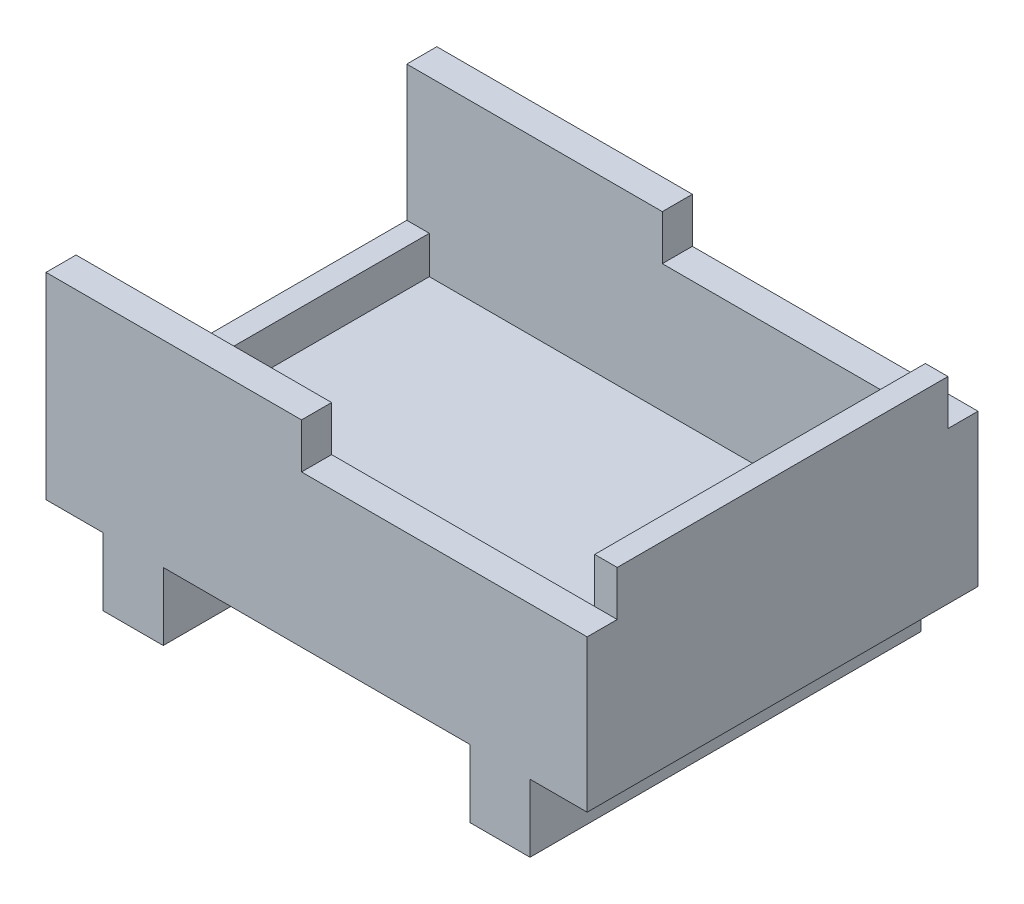
ISO-10303-21;
HEADER;
FILE_DESCRIPTION(('STEP AP214'),'2;1');
FILE_NAME('part.step','',(''),(''),'','','');
FILE_SCHEMA(('AUTOMOTIVE_DESIGN { 1 0 10303 214 1 1 1 1 }'));
ENDSEC;
DATA;
#1=APPLICATION_CONTEXT('core data for automotive mechanical design processes');
#2=APPLICATION_PROTOCOL_DEFINITION('international standard','automotive_design',2000,#1);
#3=PRODUCT_CONTEXT('',#1,'mechanical');
#4=PRODUCT('Part','Part','',(#3));
#5=PRODUCT_RELATED_PRODUCT_CATEGORY('part','',(#4));
#6=PRODUCT_DEFINITION_FORMATION('','',#4);
#7=PRODUCT_DEFINITION_CONTEXT('part definition',#1,'design');
#8=PRODUCT_DEFINITION('design','',#6,#7);
#9=PRODUCT_DEFINITION_SHAPE('','',#8);
#10=(LENGTH_UNIT() NAMED_UNIT(*) SI_UNIT(.MILLI.,.METRE.));
#11=(NAMED_UNIT(*) PLANE_ANGLE_UNIT() SI_UNIT($,.RADIAN.));
#12=(NAMED_UNIT(*) SI_UNIT($,.STERADIAN.) SOLID_ANGLE_UNIT());
#13=UNCERTAINTY_MEASURE_WITH_UNIT(LENGTH_MEASURE(1.E-05),#10,'distance_accuracy_value','');
#14=(GEOMETRIC_REPRESENTATION_CONTEXT(3) GLOBAL_UNCERTAINTY_ASSIGNED_CONTEXT((#13)) GLOBAL_UNIT_ASSIGNED_CONTEXT((#10,
#11,#12)) REPRESENTATION_CONTEXT('',''));
#15=CARTESIAN_POINT('',(0.,0.,0.));
#16=DIRECTION('',(0.,0.,1.));
#17=DIRECTION('',(1.,0.,0.));
#18=AXIS2_PLACEMENT_3D('',#15,#16,#17);
#19=CARTESIAN_POINT('',(0.,0.,0.));
#20=DIRECTION('',(0.,1.,0.));
#21=DIRECTION('',(0.,0.,1.));
#22=AXIS2_PLACEMENT_3D('',#19,#20,#21);
#23=PLANE('',#22);
#24=DIRECTION('',(0.,0.,1.));
#25=VECTOR('',#24,1.);
#26=CARTESIAN_POINT('',(-10.2,0.,-13.));
#27=LINE('',#26,#25);
#28=CARTESIAN_POINT('',(-10.2,0.,-13.));
#29=VERTEX_POINT('',#28);
#30=CARTESIAN_POINT('',(-10.2,0.,-10.));
#31=VERTEX_POINT('',#30);
#32=EDGE_CURVE('E298',#29,#31,#27,.T.);
#33=ORIENTED_EDGE('',*,*,#32,.F.);
#34=DIRECTION('',(-1.,0.,0.));
#35=VECTOR('',#34,1.);
#36=CARTESIAN_POINT('',(-18.,0.,-13.));
#37=LINE('',#36,#35);
#38=CARTESIAN_POINT('',(10.2,0.,-13.));
#39=VERTEX_POINT('',#38);
#40=EDGE_CURVE('E494',#39,#29,#37,.T.);
#41=ORIENTED_EDGE('',*,*,#40,.F.);
#42=DIRECTION('',(0.,0.,-1.));
#43=VECTOR('',#42,1.);
#44=CARTESIAN_POINT('',(10.2,0.,-13.));
#45=LINE('',#44,#43);
#46=CARTESIAN_POINT('',(10.2,0.,-9.99999999999999));
#47=VERTEX_POINT('',#46);
#48=EDGE_CURVE('E319',#47,#39,#45,.T.);
#49=ORIENTED_EDGE('',*,*,#48,.F.);
#50=DIRECTION('',(-1.,0.,0.));
#51=VECTOR('',#50,1.);
#52=CARTESIAN_POINT('',(10.2,0.,-9.99999999999999));
#53=LINE('',#52,#51);
#54=CARTESIAN_POINT('',(14.2,0.,-9.99999999999999));
#55=VERTEX_POINT('',#54);
#56=EDGE_CURVE('E321',#55,#47,#53,.T.);
#57=ORIENTED_EDGE('',*,*,#56,.F.);
#58=DIRECTION('',(0.,0.,1.));
#59=VECTOR('',#58,1.);
#60=CARTESIAN_POINT('',(14.2,0.,-13.));
#61=LINE('',#60,#59);
#62=CARTESIAN_POINT('',(14.2,0.,-13.));
#63=VERTEX_POINT('',#62);
#64=EDGE_CURVE('E315',#63,#55,#61,.T.);
#65=ORIENTED_EDGE('',*,*,#64,.F.);
#66=CARTESIAN_POINT('',(18.,0.,-13.));
#67=VERTEX_POINT('',#66);
#68=EDGE_CURVE('E490',#67,#63,#37,.T.);
#69=ORIENTED_EDGE('',*,*,#68,.F.);
#70=DIRECTION('',(0.,0.,-1.));
#71=VECTOR('',#70,1.);
#72=CARTESIAN_POINT('',(18.,0.,-13.));
#73=LINE('',#72,#71);
#74=CARTESIAN_POINT('',(18.,0.,13.));
#75=VERTEX_POINT('',#74);
#76=EDGE_CURVE('E478',#75,#67,#73,.T.);
#77=ORIENTED_EDGE('',*,*,#76,.F.);
#78=DIRECTION('',(1.,0.,0.));
#79=VECTOR('',#78,1.);
#80=CARTESIAN_POINT('',(-18.,0.,13.));
#81=LINE('',#80,#79);
#82=CARTESIAN_POINT('',(14.2,0.,13.));
#83=VERTEX_POINT('',#82);
#84=EDGE_CURVE('E497',#83,#75,#81,.T.);
#85=ORIENTED_EDGE('',*,*,#84,.F.);
#86=DIRECTION('',(0.,0.,1.));
#87=VECTOR('',#86,1.);
#88=CARTESIAN_POINT('',(14.2,0.,13.));
#89=LINE('',#88,#87);
#90=CARTESIAN_POINT('',(14.2,0.,9.99999999999999));
#91=VERTEX_POINT('',#90);
#92=EDGE_CURVE('E338',#91,#83,#89,.T.);
#93=ORIENTED_EDGE('',*,*,#92,.F.);
#94=DIRECTION('',(1.,0.,0.));
#95=VECTOR('',#94,1.);
#96=CARTESIAN_POINT('',(10.2,0.,9.99999999999999));
#97=LINE('',#96,#95);
#98=CARTESIAN_POINT('',(10.2,0.,9.99999999999999));
#99=VERTEX_POINT('',#98);
#100=EDGE_CURVE('E341',#99,#91,#97,.T.);
#101=ORIENTED_EDGE('',*,*,#100,.F.);
#102=DIRECTION('',(0.,0.,-1.));
#103=VECTOR('',#102,1.);
#104=CARTESIAN_POINT('',(10.2,0.,13.));
#105=LINE('',#104,#103);
#106=CARTESIAN_POINT('',(10.2,0.,13.));
#107=VERTEX_POINT('',#106);
#108=EDGE_CURVE('E333',#107,#99,#105,.T.);
#109=ORIENTED_EDGE('',*,*,#108,.F.);
#110=CARTESIAN_POINT('',(-10.2,0.,13.));
#111=VERTEX_POINT('',#110);
#112=EDGE_CURVE('E502',#111,#107,#81,.T.);
#113=ORIENTED_EDGE('',*,*,#112,.F.);
#114=DIRECTION('',(0.,0.,1.));
#115=VECTOR('',#114,1.);
#116=CARTESIAN_POINT('',(-10.2,0.,13.));
#117=LINE('',#116,#115);
#118=CARTESIAN_POINT('',(-10.2,0.,9.99999999999999));
#119=VERTEX_POINT('',#118);
#120=EDGE_CURVE('E358',#119,#111,#117,.T.);
#121=ORIENTED_EDGE('',*,*,#120,.F.);
#122=DIRECTION('',(1.,0.,0.));
#123=VECTOR('',#122,1.);
#124=CARTESIAN_POINT('',(-10.2,0.,9.99999999999999));
#125=LINE('',#124,#123);
#126=CARTESIAN_POINT('',(-14.2,0.,9.99999999999999));
#127=VERTEX_POINT('',#126);
#128=EDGE_CURVE('E360',#127,#119,#125,.T.);
#129=ORIENTED_EDGE('',*,*,#128,.F.);
#130=DIRECTION('',(0.,0.,-1.));
#131=VECTOR('',#130,1.);
#132=CARTESIAN_POINT('',(-14.2,0.,13.));
#133=LINE('',#132,#131);
#134=CARTESIAN_POINT('',(-14.2,0.,13.));
#135=VERTEX_POINT('',#134);
#136=EDGE_CURVE('E353',#135,#127,#133,.T.);
#137=ORIENTED_EDGE('',*,*,#136,.F.);
#138=CARTESIAN_POINT('',(-18.,0.,13.));
#139=VERTEX_POINT('',#138);
#140=EDGE_CURVE('E498',#139,#135,#81,.T.);
#141=ORIENTED_EDGE('',*,*,#140,.F.);
#142=DIRECTION('',(0.,0.,1.));
#143=VECTOR('',#142,1.);
#144=CARTESIAN_POINT('',(-18.,0.,-13.));
#145=LINE('',#144,#143);
#146=CARTESIAN_POINT('',(-18.,0.,-13.));
#147=VERTEX_POINT('',#146);
#148=EDGE_CURVE('E493',#147,#139,#145,.T.);
#149=ORIENTED_EDGE('',*,*,#148,.F.);
#150=CARTESIAN_POINT('',(-14.2,0.,-13.));
#151=VERTEX_POINT('',#150);
#152=EDGE_CURVE('E489',#151,#147,#37,.T.);
#153=ORIENTED_EDGE('',*,*,#152,.F.);
#154=DIRECTION('',(0.,0.,-1.));
#155=VECTOR('',#154,1.);
#156=CARTESIAN_POINT('',(-14.2,0.,-13.));
#157=LINE('',#156,#155);
#158=CARTESIAN_POINT('',(-14.2,0.,-10.));
#159=VERTEX_POINT('',#158);
#160=EDGE_CURVE('E256',#159,#151,#157,.T.);
#161=ORIENTED_EDGE('',*,*,#160,.F.);
#162=DIRECTION('',(-1.,0.,0.));
#163=VECTOR('',#162,1.);
#164=CARTESIAN_POINT('',(-10.2,0.,-10.));
#165=LINE('',#164,#163);
#166=EDGE_CURVE('E308',#31,#159,#165,.T.);
#167=ORIENTED_EDGE('',*,*,#166,.F.);
#168=EDGE_LOOP('',(#33,#41,#49,#57,#65,#69,#77,#85,#93,#101,#109,#113,#121,#129,#137,#141,#149,
#153,#161,#167));
#169=FACE_BOUND('',#168,.T.);
#170=ADVANCED_FACE('F36',(#169),#23,.F.);
#171=CARTESIAN_POINT('',(0.,10.1,0.));
#172=DIRECTION('',(0.,1.,0.));
#173=DIRECTION('',(0.,0.,1.));
#174=AXIS2_PLACEMENT_3D('',#171,#172,#173);
#175=PLANE('',#174);
#176=DIRECTION('',(0.,0.,-1.));
#177=VECTOR('',#176,1.);
#178=CARTESIAN_POINT('',(18.,10.1,-13.));
#179=LINE('',#178,#177);
#180=CARTESIAN_POINT('',(18.,10.1,13.));
#181=VERTEX_POINT('',#180);
#182=CARTESIAN_POINT('',(18.,10.1,11.));
#183=VERTEX_POINT('',#182);
#184=EDGE_CURVE('E457',#181,#183,#179,.T.);
#185=ORIENTED_EDGE('',*,*,#184,.T.);
#186=DIRECTION('',(1.,0.,0.));
#187=VECTOR('',#186,1.);
#188=CARTESIAN_POINT('',(16.5,10.1,11.));
#189=LINE('',#188,#187);
#190=CARTESIAN_POINT('',(16.5,10.1,11.));
#191=VERTEX_POINT('',#190);
#192=EDGE_CURVE('E375',#191,#183,#189,.T.);
#193=ORIENTED_EDGE('',*,*,#192,.F.);
#194=DIRECTION('',(-1.,0.,0.));
#195=VECTOR('',#194,1.);
#196=CARTESIAN_POINT('',(-16.5,10.1,11.));
#197=LINE('',#196,#195);
#198=CARTESIAN_POINT('',(-0.999999999999997,10.1,11.));
#199=VERTEX_POINT('',#198);
#200=EDGE_CURVE('E461',#191,#199,#197,.T.);
#201=ORIENTED_EDGE('',*,*,#200,.T.);
#202=DIRECTION('',(0.,0.,-1.));
#203=VECTOR('',#202,1.);
#204=CARTESIAN_POINT('',(-0.999999999999997,10.1,11.));
#205=LINE('',#204,#203);
#206=CARTESIAN_POINT('',(-0.999999999999997,10.1,13.));
#207=VERTEX_POINT('',#206);
#208=EDGE_CURVE('E402',#207,#199,#205,.T.);
#209=ORIENTED_EDGE('',*,*,#208,.F.);
#210=DIRECTION('',(1.,0.,0.));
#211=VECTOR('',#210,1.);
#212=CARTESIAN_POINT('',(-18.,10.1,13.));
#213=LINE('',#212,#211);
#214=EDGE_CURVE('E453',#207,#181,#213,.T.);
#215=ORIENTED_EDGE('',*,*,#214,.T.);
#216=EDGE_LOOP('',(#185,#193,#201,#209,#215));
#217=FACE_BOUND('',#216,.T.);
#218=ADVANCED_FACE('F567',(#217),#175,.T.);
#219=DIRECTION('',(1.,0.,0.));
#220=VECTOR('',#219,1.);
#221=CARTESIAN_POINT('',(-16.5,10.1,-11.));
#222=LINE('',#221,#220);
#223=CARTESIAN_POINT('',(-0.999999999999997,10.1,-11.));
#224=VERTEX_POINT('',#223);
#225=CARTESIAN_POINT('',(16.5,10.1,-11.));
#226=VERTEX_POINT('',#225);
#227=EDGE_CURVE('E11',#224,#226,#222,.T.);
#228=ORIENTED_EDGE('',*,*,#227,.T.);
#229=DIRECTION('',(-1.,0.,0.));
#230=VECTOR('',#229,1.);
#231=CARTESIAN_POINT('',(16.5,10.1,-11.));
#232=LINE('',#231,#230);
#233=CARTESIAN_POINT('',(18.,10.1,-11.));
#234=VERTEX_POINT('',#233);
#235=EDGE_CURVE('E380',#234,#226,#232,.T.);
#236=ORIENTED_EDGE('',*,*,#235,.F.);
#237=CARTESIAN_POINT('',(18.,10.1,-13.));
#238=VERTEX_POINT('',#237);
#239=EDGE_CURVE('E456',#234,#238,#179,.T.);
#240=ORIENTED_EDGE('',*,*,#239,.T.);
#241=DIRECTION('',(-1.,0.,0.));
#242=VECTOR('',#241,1.);
#243=CARTESIAN_POINT('',(-18.,10.1,-13.));
#244=LINE('',#243,#242);
#245=CARTESIAN_POINT('',(-0.999999999999997,10.1,-13.));
#246=VERTEX_POINT('',#245);
#247=EDGE_CURVE('E459',#238,#246,#244,.T.);
#248=ORIENTED_EDGE('',*,*,#247,.T.);
#249=DIRECTION('',(0.,0.,-1.));
#250=VECTOR('',#249,1.);
#251=CARTESIAN_POINT('',(-0.999999999999997,10.1,-13.));
#252=LINE('',#251,#250);
#253=EDGE_CURVE('E421',#224,#246,#252,.T.);
#254=ORIENTED_EDGE('',*,*,#253,.F.);
#255=EDGE_LOOP('',(#228,#236,#240,#248,#254));
#256=FACE_BOUND('',#255,.T.);
#257=ADVANCED_FACE('F572',(#256),#175,.T.);
#258=CARTESIAN_POINT('',(18.,14.6,-13.));
#259=DIRECTION('',(-1.,0.,0.));
#260=DIRECTION('',(0.,0.,1.));
#261=AXIS2_PLACEMENT_3D('',#258,#259,#260);
#262=PLANE('',#261);
#263=ORIENTED_EDGE('',*,*,#184,.F.);
#264=DIRECTION('',(0.,-1.,0.));
#265=VECTOR('',#264,1.);
#266=CARTESIAN_POINT('',(18.,14.6,13.));
#267=LINE('',#266,#265);
#268=EDGE_CURVE('E501',#181,#75,#267,.T.);
#269=ORIENTED_EDGE('',*,*,#268,.T.);
#270=ORIENTED_EDGE('',*,*,#76,.T.);
#271=DIRECTION('',(0.,-1.,0.));
#272=VECTOR('',#271,1.);
#273=CARTESIAN_POINT('',(18.,14.6,-13.));
#274=LINE('',#273,#272);
#275=EDGE_CURVE('E44',#238,#67,#274,.T.);
#276=ORIENTED_EDGE('',*,*,#275,.F.);
#277=ORIENTED_EDGE('',*,*,#239,.F.);
#278=DIRECTION('',(0.,-1.,0.));
#279=VECTOR('',#278,1.);
#280=CARTESIAN_POINT('',(18.,13.1,-11.));
#281=LINE('',#280,#279);
#282=CARTESIAN_POINT('',(18.,13.1,-11.));
#283=VERTEX_POINT('',#282);
#284=EDGE_CURVE('E393',#283,#234,#281,.T.);
#285=ORIENTED_EDGE('',*,*,#284,.F.);
#286=DIRECTION('',(0.,0.,-1.));
#287=VECTOR('',#286,1.);
#288=CARTESIAN_POINT('',(18.,13.1,11.));
#289=LINE('',#288,#287);
#290=CARTESIAN_POINT('',(18.,13.1,11.));
#291=VERTEX_POINT('',#290);
#292=EDGE_CURVE('E382',#291,#283,#289,.T.);
#293=ORIENTED_EDGE('',*,*,#292,.F.);
#294=DIRECTION('',(0.,-1.,0.));
#295=VECTOR('',#294,1.);
#296=CARTESIAN_POINT('',(18.,13.1,11.));
#297=LINE('',#296,#295);
#298=EDGE_CURVE('E396',#291,#183,#297,.T.);
#299=ORIENTED_EDGE('',*,*,#298,.T.);
#300=EDGE_LOOP('',(#263,#269,#270,#276,#277,#285,#293,#299));
#301=FACE_BOUND('',#300,.T.);
#302=ADVANCED_FACE('F38',(#301),#262,.F.);
#303=CARTESIAN_POINT('',(-18.,14.6,-13.));
#304=DIRECTION('',(0.,0.,1.));
#305=DIRECTION('',(1.,0.,0.));
#306=AXIS2_PLACEMENT_3D('',#303,#304,#305);
#307=PLANE('',#306);
#308=ORIENTED_EDGE('',*,*,#247,.F.);
#309=ORIENTED_EDGE('',*,*,#275,.T.);
#310=ORIENTED_EDGE('',*,*,#68,.T.);
#311=DIRECTION('',(0.,1.,0.));
#312=VECTOR('',#311,1.);
#313=CARTESIAN_POINT('',(14.2,-2.,-13.));
#314=LINE('',#313,#312);
#315=CARTESIAN_POINT('',(14.2,-4.5,-13.));
#316=VERTEX_POINT('',#315);
#317=EDGE_CURVE('E331',#316,#63,#314,.T.);
#318=ORIENTED_EDGE('',*,*,#317,.F.);
#319=DIRECTION('',(1.,0.,0.));
#320=VECTOR('',#319,1.);
#321=CARTESIAN_POINT('',(14.2,-4.5,-13.));
#322=LINE('',#321,#320);
#323=CARTESIAN_POINT('',(10.2,-4.5,-13.));
#324=VERTEX_POINT('',#323);
#325=EDGE_CURVE('E295',#324,#316,#322,.T.);
#326=ORIENTED_EDGE('',*,*,#325,.F.);
#327=DIRECTION('',(0.,1.,0.));
#328=VECTOR('',#327,1.);
#329=CARTESIAN_POINT('',(10.2,-2.,-13.));
#330=LINE('',#329,#328);
#331=EDGE_CURVE('E58',#324,#39,#330,.T.);
#332=ORIENTED_EDGE('',*,*,#331,.T.);
#333=ORIENTED_EDGE('',*,*,#40,.T.);
#334=DIRECTION('',(0.,1.,0.));
#335=VECTOR('',#334,1.);
#336=CARTESIAN_POINT('',(-10.2,-2.,-13.));
#337=LINE('',#336,#335);
#338=CARTESIAN_POINT('',(-10.2,-4.5,-13.));
#339=VERTEX_POINT('',#338);
#340=EDGE_CURVE('E259',#339,#29,#337,.T.);
#341=ORIENTED_EDGE('',*,*,#340,.F.);
#342=DIRECTION('',(1.,0.,0.));
#343=VECTOR('',#342,1.);
#344=CARTESIAN_POINT('',(-14.2,-4.5,-13.));
#345=LINE('',#344,#343);
#346=CARTESIAN_POINT('',(-14.2,-4.5,-13.));
#347=VERTEX_POINT('',#346);
#348=EDGE_CURVE('E262',#347,#339,#345,.T.);
#349=ORIENTED_EDGE('',*,*,#348,.F.);
#350=DIRECTION('',(0.,1.,0.));
#351=VECTOR('',#350,1.);
#352=CARTESIAN_POINT('',(-14.2,-2.,-13.));
#353=LINE('',#352,#351);
#354=EDGE_CURVE('E51',#347,#151,#353,.T.);
#355=ORIENTED_EDGE('',*,*,#354,.T.);
#356=ORIENTED_EDGE('',*,*,#152,.T.);
#357=DIRECTION('',(0.,-1.,0.));
#358=VECTOR('',#357,1.);
#359=CARTESIAN_POINT('',(-18.,14.6,-13.));
#360=LINE('',#359,#358);
#361=CARTESIAN_POINT('',(-18.,13.1,-13.));
#362=VERTEX_POINT('',#361);
#363=EDGE_CURVE('E507',#362,#147,#360,.T.);
#364=ORIENTED_EDGE('',*,*,#363,.F.);
#365=DIRECTION('',(-1.,0.,0.));
#366=VECTOR('',#365,1.);
#367=CARTESIAN_POINT('',(-18.,13.1,-13.));
#368=LINE('',#367,#366);
#369=CARTESIAN_POINT('',(-0.999999999999997,13.1,-13.));
#370=VERTEX_POINT('',#369);
#371=EDGE_CURVE('E429',#370,#362,#368,.T.);
#372=ORIENTED_EDGE('',*,*,#371,.F.);
#373=DIRECTION('',(0.,-1.,0.));
#374=VECTOR('',#373,1.);
#375=CARTESIAN_POINT('',(-0.999999999999997,13.1,-13.));
#376=LINE('',#375,#374);
#377=EDGE_CURVE('E432',#370,#246,#376,.T.);
#378=ORIENTED_EDGE('',*,*,#377,.T.);
#379=EDGE_LOOP('',(#308,#309,#310,#318,#326,#332,#333,#341,#349,#355,#356,#364,#372,#378));
#380=FACE_BOUND('',#379,.T.);
#381=ADVANCED_FACE('F264',(#380),#307,.F.);
#382=CARTESIAN_POINT('',(-18.,14.6,-13.));
#383=DIRECTION('',(1.,0.,0.));
#384=DIRECTION('',(0.,0.,-1.));
#385=AXIS2_PLACEMENT_3D('',#382,#383,#384);
#386=PLANE('',#385);
#387=DIRECTION('',(0.,-1.,0.));
#388=VECTOR('',#387,1.);
#389=CARTESIAN_POINT('',(-18.,14.6,13.));
#390=LINE('',#389,#388);
#391=CARTESIAN_POINT('',(-18.,13.1,13.));
#392=VERTEX_POINT('',#391);
#393=EDGE_CURVE('E505',#392,#139,#390,.T.);
#394=ORIENTED_EDGE('',*,*,#393,.F.);
#395=DIRECTION('',(0.,0.,1.));
#396=VECTOR('',#395,1.);
#397=CARTESIAN_POINT('',(-18.,13.1,11.));
#398=LINE('',#397,#396);
#399=CARTESIAN_POINT('',(-18.,13.1,11.));
#400=VERTEX_POINT('',#399);
#401=EDGE_CURVE('E403',#400,#392,#398,.T.);
#402=ORIENTED_EDGE('',*,*,#401,.F.);
#403=DIRECTION('',(0.,1.,0.));
#404=VECTOR('',#403,1.);
#405=CARTESIAN_POINT('',(-18.,4.1,11.));
#406=LINE('',#405,#404);
#407=CARTESIAN_POINT('',(-18.,4.1,11.));
#408=VERTEX_POINT('',#407);
#409=EDGE_CURVE('E451',#408,#400,#406,.T.);
#410=ORIENTED_EDGE('',*,*,#409,.F.);
#411=DIRECTION('',(0.,0.,1.));
#412=VECTOR('',#411,1.);
#413=CARTESIAN_POINT('',(-18.,4.1,-11.));
#414=LINE('',#413,#412);
#415=CARTESIAN_POINT('',(-18.,4.1,-11.));
#416=VERTEX_POINT('',#415);
#417=EDGE_CURVE('E446',#416,#408,#414,.T.);
#418=ORIENTED_EDGE('',*,*,#417,.F.);
#419=DIRECTION('',(0.,1.,0.));
#420=VECTOR('',#419,1.);
#421=CARTESIAN_POINT('',(-18.,4.1,-11.));
#422=LINE('',#421,#420);
#423=CARTESIAN_POINT('',(-18.,13.1,-11.));
#424=VERTEX_POINT('',#423);
#425=EDGE_CURVE('E450',#416,#424,#422,.T.);
#426=ORIENTED_EDGE('',*,*,#425,.T.);
#427=DIRECTION('',(0.,0.,1.));
#428=VECTOR('',#427,1.);
#429=CARTESIAN_POINT('',(-18.,13.1,-13.));
#430=LINE('',#429,#428);
#431=EDGE_CURVE('E422',#362,#424,#430,.T.);
#432=ORIENTED_EDGE('',*,*,#431,.F.);
#433=ORIENTED_EDGE('',*,*,#363,.T.);
#434=ORIENTED_EDGE('',*,*,#148,.T.);
#435=EDGE_LOOP('',(#394,#402,#410,#418,#426,#432,#433,#434));
#436=FACE_BOUND('',#435,.T.);
#437=ADVANCED_FACE('F545',(#436),#386,.F.);
#438=CARTESIAN_POINT('',(-18.,14.6,13.));
#439=DIRECTION('',(0.,0.,-1.));
#440=DIRECTION('',(-1.,0.,0.));
#441=AXIS2_PLACEMENT_3D('',#438,#439,#440);
#442=PLANE('',#441);
#443=ORIENTED_EDGE('',*,*,#214,.F.);
#444=DIRECTION('',(0.,-1.,0.));
#445=VECTOR('',#444,1.);
#446=CARTESIAN_POINT('',(-0.999999999999997,13.1,13.));
#447=LINE('',#446,#445);
#448=CARTESIAN_POINT('',(-0.999999999999997,13.1,13.));
#449=VERTEX_POINT('',#448);
#450=EDGE_CURVE('E418',#449,#207,#447,.T.);
#451=ORIENTED_EDGE('',*,*,#450,.F.);
#452=DIRECTION('',(1.,0.,0.));
#453=VECTOR('',#452,1.);
#454=CARTESIAN_POINT('',(-18.,13.1,13.));
#455=LINE('',#454,#453);
#456=EDGE_CURVE('E406',#392,#449,#455,.T.);
#457=ORIENTED_EDGE('',*,*,#456,.F.);
#458=ORIENTED_EDGE('',*,*,#393,.T.);
#459=ORIENTED_EDGE('',*,*,#140,.T.);
#460=DIRECTION('',(0.,1.,0.));
#461=VECTOR('',#460,1.);
#462=CARTESIAN_POINT('',(-14.2,-2.,13.));
#463=LINE('',#462,#461);
#464=CARTESIAN_POINT('',(-14.2,-4.5,13.));
#465=VERTEX_POINT('',#464);
#466=EDGE_CURVE('E357',#465,#135,#463,.T.);
#467=ORIENTED_EDGE('',*,*,#466,.F.);
#468=DIRECTION('',(-1.,0.,0.));
#469=VECTOR('',#468,1.);
#470=CARTESIAN_POINT('',(-14.2,-4.5,13.));
#471=LINE('',#470,#469);
#472=CARTESIAN_POINT('',(-10.2,-4.5,13.));
#473=VERTEX_POINT('',#472);
#474=EDGE_CURVE('E273',#473,#465,#471,.T.);
#475=ORIENTED_EDGE('',*,*,#474,.F.);
#476=DIRECTION('',(0.,1.,0.));
#477=VECTOR('',#476,1.);
#478=CARTESIAN_POINT('',(-10.2,-2.,13.));
#479=LINE('',#478,#477);
#480=EDGE_CURVE('E366',#473,#111,#479,.T.);
#481=ORIENTED_EDGE('',*,*,#480,.T.);
#482=ORIENTED_EDGE('',*,*,#112,.T.);
#483=DIRECTION('',(0.,1.,0.));
#484=VECTOR('',#483,1.);
#485=CARTESIAN_POINT('',(10.2,-2.,13.));
#486=LINE('',#485,#484);
#487=CARTESIAN_POINT('',(10.2,-4.5,13.));
#488=VERTEX_POINT('',#487);
#489=EDGE_CURVE('E337',#488,#107,#486,.T.);
#490=ORIENTED_EDGE('',*,*,#489,.F.);
#491=DIRECTION('',(-1.,0.,0.));
#492=VECTOR('',#491,1.);
#493=CARTESIAN_POINT('',(14.2,-4.5,13.));
#494=LINE('',#493,#492);
#495=CARTESIAN_POINT('',(14.2,-4.5,13.));
#496=VERTEX_POINT('',#495);
#497=EDGE_CURVE('E288',#496,#488,#494,.T.);
#498=ORIENTED_EDGE('',*,*,#497,.F.);
#499=DIRECTION('',(0.,1.,0.));
#500=VECTOR('',#499,1.);
#501=CARTESIAN_POINT('',(14.2,-2.,13.));
#502=LINE('',#501,#500);
#503=EDGE_CURVE('E346',#496,#83,#502,.T.);
#504=ORIENTED_EDGE('',*,*,#503,.T.);
#505=ORIENTED_EDGE('',*,*,#84,.T.);
#506=ORIENTED_EDGE('',*,*,#268,.F.);
#507=EDGE_LOOP('',(#443,#451,#457,#458,#459,#467,#475,#481,#482,#490,#498,#504,#505,#506));
#508=FACE_BOUND('',#507,.T.);
#509=ADVANCED_FACE('F523',(#508),#442,.F.);
#510=CARTESIAN_POINT('',(0.,1.6,0.));
#511=DIRECTION('',(0.,1.,0.));
#512=DIRECTION('',(0.,0.,1.));
#513=AXIS2_PLACEMENT_3D('',#510,#511,#512);
#514=PLANE('',#513);
#515=DIRECTION('',(0.,0.,-1.));
#516=VECTOR('',#515,1.);
#517=CARTESIAN_POINT('',(16.5,1.6,-11.));
#518=LINE('',#517,#516);
#519=CARTESIAN_POINT('',(16.5,1.6,11.));
#520=VERTEX_POINT('',#519);
#521=CARTESIAN_POINT('',(16.5,1.6,-11.));
#522=VERTEX_POINT('',#521);
#523=EDGE_CURVE('E463',#520,#522,#518,.T.);
#524=ORIENTED_EDGE('',*,*,#523,.T.);
#525=DIRECTION('',(-1.,0.,0.));
#526=VECTOR('',#525,1.);
#527=CARTESIAN_POINT('',(-16.5,1.6,-11.));
#528=LINE('',#527,#526);
#529=CARTESIAN_POINT('',(-16.5,1.6,-11.));
#530=VERTEX_POINT('',#529);
#531=EDGE_CURVE('E466',#522,#530,#528,.T.);
#532=ORIENTED_EDGE('',*,*,#531,.T.);
#533=DIRECTION('',(0.,0.,1.));
#534=VECTOR('',#533,1.);
#535=CARTESIAN_POINT('',(-16.5,1.6,-11.));
#536=LINE('',#535,#534);
#537=CARTESIAN_POINT('',(-16.5,1.6,11.));
#538=VERTEX_POINT('',#537);
#539=EDGE_CURVE('E469',#530,#538,#536,.T.);
#540=ORIENTED_EDGE('',*,*,#539,.T.);
#541=DIRECTION('',(1.,0.,0.));
#542=VECTOR('',#541,1.);
#543=CARTESIAN_POINT('',(-16.5,1.6,11.));
#544=LINE('',#543,#542);
#545=EDGE_CURVE('E472',#538,#520,#544,.T.);
#546=ORIENTED_EDGE('',*,*,#545,.T.);
#547=EDGE_LOOP('',(#524,#532,#540,#546));
#548=FACE_BOUND('',#547,.T.);
#549=ADVANCED_FACE('F581',(#548),#514,.T.);
#550=CARTESIAN_POINT('',(-16.5,1.6,-11.));
#551=DIRECTION('',(0.,0.,-1.));
#552=DIRECTION('',(-1.,0.,0.));
#553=AXIS2_PLACEMENT_3D('',#550,#551,#552);
#554=PLANE('',#553);
#555=ORIENTED_EDGE('',*,*,#227,.F.);
#556=DIRECTION('',(0.,-1.,0.));
#557=VECTOR('',#556,1.);
#558=CARTESIAN_POINT('',(-0.999999999999997,13.1,-11.));
#559=LINE('',#558,#557);
#560=CARTESIAN_POINT('',(-0.999999999999997,13.1,-11.));
#561=VERTEX_POINT('',#560);
#562=EDGE_CURVE('E437',#561,#224,#559,.T.);
#563=ORIENTED_EDGE('',*,*,#562,.F.);
#564=DIRECTION('',(1.,0.,0.));
#565=VECTOR('',#564,1.);
#566=CARTESIAN_POINT('',(-18.,13.1,-11.));
#567=LINE('',#566,#565);
#568=EDGE_CURVE('E425',#424,#561,#567,.T.);
#569=ORIENTED_EDGE('',*,*,#568,.F.);
#570=ORIENTED_EDGE('',*,*,#425,.F.);
#571=DIRECTION('',(-1.,0.,0.));
#572=VECTOR('',#571,1.);
#573=CARTESIAN_POINT('',(-16.5,4.1,-11.));
#574=LINE('',#573,#572);
#575=CARTESIAN_POINT('',(-16.5,4.1,-11.));
#576=VERTEX_POINT('',#575);
#577=EDGE_CURVE('E443',#576,#416,#574,.T.);
#578=ORIENTED_EDGE('',*,*,#577,.F.);
#579=DIRECTION('',(0.,1.,0.));
#580=VECTOR('',#579,1.);
#581=CARTESIAN_POINT('',(-16.5,1.6,-11.));
#582=LINE('',#581,#580);
#583=EDGE_CURVE('E482',#530,#576,#582,.T.);
#584=ORIENTED_EDGE('',*,*,#583,.F.);
#585=ORIENTED_EDGE('',*,*,#531,.F.);
#586=DIRECTION('',(0.,1.,0.));
#587=VECTOR('',#586,1.);
#588=CARTESIAN_POINT('',(16.5,1.6,-11.));
#589=LINE('',#588,#587);
#590=EDGE_CURVE('E475',#522,#226,#589,.T.);
#591=ORIENTED_EDGE('',*,*,#590,.T.);
#592=EDGE_LOOP('',(#555,#563,#569,#570,#578,#584,#585,#591));
#593=FACE_BOUND('',#592,.T.);
#594=ADVANCED_FACE('F599',(#593),#554,.F.);
#595=CARTESIAN_POINT('',(-16.5,1.6,-11.));
#596=DIRECTION('',(-1.,0.,0.));
#597=DIRECTION('',(0.,0.,1.));
#598=AXIS2_PLACEMENT_3D('',#595,#596,#597);
#599=PLANE('',#598);
#600=ORIENTED_EDGE('',*,*,#583,.T.);
#601=DIRECTION('',(0.,0.,-1.));
#602=VECTOR('',#601,1.);
#603=CARTESIAN_POINT('',(-16.5,4.1,-11.));
#604=LINE('',#603,#602);
#605=CARTESIAN_POINT('',(-16.5,4.1,11.));
#606=VERTEX_POINT('',#605);
#607=EDGE_CURVE('E440',#606,#576,#604,.T.);
#608=ORIENTED_EDGE('',*,*,#607,.F.);
#609=DIRECTION('',(0.,1.,0.));
#610=VECTOR('',#609,1.);
#611=CARTESIAN_POINT('',(-16.5,1.6,11.));
#612=LINE('',#611,#610);
#613=EDGE_CURVE('E479',#538,#606,#612,.T.);
#614=ORIENTED_EDGE('',*,*,#613,.F.);
#615=ORIENTED_EDGE('',*,*,#539,.F.);
#616=EDGE_LOOP('',(#600,#608,#614,#615));
#617=FACE_BOUND('',#616,.T.);
#618=ADVANCED_FACE('F604',(#617),#599,.F.);
#619=CARTESIAN_POINT('',(-16.5,1.6,11.));
#620=DIRECTION('',(0.,0.,1.));
#621=DIRECTION('',(1.,0.,0.));
#622=AXIS2_PLACEMENT_3D('',#619,#620,#621);
#623=PLANE('',#622);
#624=ORIENTED_EDGE('',*,*,#200,.F.);
#625=DIRECTION('',(0.,1.,0.));
#626=VECTOR('',#625,1.);
#627=CARTESIAN_POINT('',(16.5,1.6,11.));
#628=LINE('',#627,#626);
#629=EDGE_CURVE('E476',#520,#191,#628,.T.);
#630=ORIENTED_EDGE('',*,*,#629,.F.);
#631=ORIENTED_EDGE('',*,*,#545,.F.);
#632=ORIENTED_EDGE('',*,*,#613,.T.);
#633=DIRECTION('',(1.,0.,0.));
#634=VECTOR('',#633,1.);
#635=CARTESIAN_POINT('',(-16.5,4.1,11.));
#636=LINE('',#635,#634);
#637=EDGE_CURVE('E448',#408,#606,#636,.T.);
#638=ORIENTED_EDGE('',*,*,#637,.F.);
#639=ORIENTED_EDGE('',*,*,#409,.T.);
#640=DIRECTION('',(-1.,0.,0.));
#641=VECTOR('',#640,1.);
#642=CARTESIAN_POINT('',(-18.,13.1,11.));
#643=LINE('',#642,#641);
#644=CARTESIAN_POINT('',(-0.999999999999997,13.1,11.));
#645=VERTEX_POINT('',#644);
#646=EDGE_CURVE('E410',#645,#400,#643,.T.);
#647=ORIENTED_EDGE('',*,*,#646,.F.);
#648=DIRECTION('',(0.,-1.,0.));
#649=VECTOR('',#648,1.);
#650=CARTESIAN_POINT('',(-0.999999999999997,13.1,11.));
#651=LINE('',#650,#649);
#652=EDGE_CURVE('E413',#645,#199,#651,.T.);
#653=ORIENTED_EDGE('',*,*,#652,.T.);
#654=EDGE_LOOP('',(#624,#630,#631,#632,#638,#639,#647,#653));
#655=FACE_BOUND('',#654,.T.);
#656=ADVANCED_FACE('F601',(#655),#623,.F.);
#657=CARTESIAN_POINT('',(16.5,1.6,-11.));
#658=DIRECTION('',(1.,0.,0.));
#659=DIRECTION('',(0.,0.,-1.));
#660=AXIS2_PLACEMENT_3D('',#657,#658,#659);
#661=PLANE('',#660);
#662=ORIENTED_EDGE('',*,*,#629,.T.);
#663=DIRECTION('',(0.,-1.,0.));
#664=VECTOR('',#663,1.);
#665=CARTESIAN_POINT('',(16.5,13.1,11.));
#666=LINE('',#665,#664);
#667=CARTESIAN_POINT('',(16.5,13.1,11.));
#668=VERTEX_POINT('',#667);
#669=EDGE_CURVE('E399',#668,#191,#666,.T.);
#670=ORIENTED_EDGE('',*,*,#669,.F.);
#671=DIRECTION('',(0.,0.,1.));
#672=VECTOR('',#671,1.);
#673=CARTESIAN_POINT('',(16.5,13.1,11.));
#674=LINE('',#673,#672);
#675=CARTESIAN_POINT('',(16.5,13.1,-11.));
#676=VERTEX_POINT('',#675);
#677=EDGE_CURVE('E376',#676,#668,#674,.T.);
#678=ORIENTED_EDGE('',*,*,#677,.F.);
#679=DIRECTION('',(0.,-1.,0.));
#680=VECTOR('',#679,1.);
#681=CARTESIAN_POINT('',(16.5,13.1,-11.));
#682=LINE('',#681,#680);
#683=EDGE_CURVE('E386',#676,#226,#682,.T.);
#684=ORIENTED_EDGE('',*,*,#683,.T.);
#685=ORIENTED_EDGE('',*,*,#590,.F.);
#686=ORIENTED_EDGE('',*,*,#523,.F.);
#687=EDGE_LOOP('',(#662,#670,#678,#684,#685,#686));
#688=FACE_BOUND('',#687,.T.);
#689=ADVANCED_FACE('F577',(#688),#661,.F.);
#690=CARTESIAN_POINT('',(0.,4.1,0.));
#691=DIRECTION('',(0.,-1.,0.));
#692=DIRECTION('',(0.,0.,-1.));
#693=AXIS2_PLACEMENT_3D('',#690,#691,#692);
#694=PLANE('',#693);
#695=ORIENTED_EDGE('',*,*,#607,.T.);
#696=ORIENTED_EDGE('',*,*,#577,.T.);
#697=ORIENTED_EDGE('',*,*,#417,.T.);
#698=ORIENTED_EDGE('',*,*,#637,.T.);
#699=EDGE_LOOP('',(#695,#696,#697,#698));
#700=FACE_BOUND('',#699,.T.);
#701=ADVANCED_FACE('F595',(#700),#694,.F.);
#702=CARTESIAN_POINT('',(-0.999999999999997,13.1,-13.));
#703=DIRECTION('',(-1.,0.,0.));
#704=DIRECTION('',(0.,0.,1.));
#705=AXIS2_PLACEMENT_3D('',#702,#703,#704);
#706=PLANE('',#705);
#707=ORIENTED_EDGE('',*,*,#253,.T.);
#708=ORIENTED_EDGE('',*,*,#377,.F.);
#709=DIRECTION('',(0.,0.,-1.));
#710=VECTOR('',#709,1.);
#711=CARTESIAN_POINT('',(-0.999999999999997,13.1,-13.));
#712=LINE('',#711,#710);
#713=EDGE_CURVE('E427',#561,#370,#712,.T.);
#714=ORIENTED_EDGE('',*,*,#713,.F.);
#715=ORIENTED_EDGE('',*,*,#562,.T.);
#716=EDGE_LOOP('',(#707,#708,#714,#715));
#717=FACE_BOUND('',#716,.T.);
#718=ADVANCED_FACE('F618',(#717),#706,.F.);
#719=CARTESIAN_POINT('',(0.,13.1,0.));
#720=DIRECTION('',(0.,1.,0.));
#721=DIRECTION('',(0.,0.,1.));
#722=AXIS2_PLACEMENT_3D('',#719,#720,#721);
#723=PLANE('',#722);
#724=ORIENTED_EDGE('',*,*,#431,.T.);
#725=ORIENTED_EDGE('',*,*,#568,.T.);
#726=ORIENTED_EDGE('',*,*,#713,.T.);
#727=ORIENTED_EDGE('',*,*,#371,.T.);
#728=EDGE_LOOP('',(#724,#725,#726,#727));
#729=FACE_BOUND('',#728,.T.);
#730=ADVANCED_FACE('F622',(#729),#723,.T.);
#731=CARTESIAN_POINT('',(-0.999999999999997,13.1,11.));
#732=DIRECTION('',(-1.,0.,0.));
#733=DIRECTION('',(0.,0.,1.));
#734=AXIS2_PLACEMENT_3D('',#731,#732,#733);
#735=PLANE('',#734);
#736=ORIENTED_EDGE('',*,*,#208,.T.);
#737=ORIENTED_EDGE('',*,*,#652,.F.);
#738=DIRECTION('',(0.,0.,-1.));
#739=VECTOR('',#738,1.);
#740=CARTESIAN_POINT('',(-0.999999999999997,13.1,11.));
#741=LINE('',#740,#739);
#742=EDGE_CURVE('E408',#449,#645,#741,.T.);
#743=ORIENTED_EDGE('',*,*,#742,.F.);
#744=ORIENTED_EDGE('',*,*,#450,.T.);
#745=EDGE_LOOP('',(#736,#737,#743,#744));
#746=FACE_BOUND('',#745,.T.);
#747=ADVANCED_FACE('F635',(#746),#735,.F.);
#748=CARTESIAN_POINT('',(0.,13.1,0.));
#749=DIRECTION('',(0.,1.,0.));
#750=DIRECTION('',(0.,0.,1.));
#751=AXIS2_PLACEMENT_3D('',#748,#749,#750);
#752=PLANE('',#751);
#753=ORIENTED_EDGE('',*,*,#401,.T.);
#754=ORIENTED_EDGE('',*,*,#456,.T.);
#755=ORIENTED_EDGE('',*,*,#742,.T.);
#756=ORIENTED_EDGE('',*,*,#646,.T.);
#757=EDGE_LOOP('',(#753,#754,#755,#756));
#758=FACE_BOUND('',#757,.T.);
#759=ADVANCED_FACE('F631',(#758),#752,.T.);
#760=CARTESIAN_POINT('',(16.5,13.1,11.));
#761=DIRECTION('',(0.,0.,-1.));
#762=DIRECTION('',(-1.,0.,0.));
#763=AXIS2_PLACEMENT_3D('',#760,#761,#762);
#764=PLANE('',#763);
#765=ORIENTED_EDGE('',*,*,#192,.T.);
#766=ORIENTED_EDGE('',*,*,#298,.F.);
#767=DIRECTION('',(1.,0.,0.));
#768=VECTOR('',#767,1.);
#769=CARTESIAN_POINT('',(16.5,13.1,11.));
#770=LINE('',#769,#768);
#771=EDGE_CURVE('E379',#668,#291,#770,.T.);
#772=ORIENTED_EDGE('',*,*,#771,.F.);
#773=ORIENTED_EDGE('',*,*,#669,.T.);
#774=EDGE_LOOP('',(#765,#766,#772,#773));
#775=FACE_BOUND('',#774,.T.);
#776=ADVANCED_FACE('F642',(#775),#764,.F.);
#777=CARTESIAN_POINT('',(16.5,13.1,-11.));
#778=DIRECTION('',(0.,0.,1.));
#779=DIRECTION('',(1.,0.,0.));
#780=AXIS2_PLACEMENT_3D('',#777,#778,#779);
#781=PLANE('',#780);
#782=ORIENTED_EDGE('',*,*,#235,.T.);
#783=ORIENTED_EDGE('',*,*,#683,.F.);
#784=DIRECTION('',(-1.,0.,0.));
#785=VECTOR('',#784,1.);
#786=CARTESIAN_POINT('',(16.5,13.1,-11.));
#787=LINE('',#786,#785);
#788=EDGE_CURVE('E384',#283,#676,#787,.T.);
#789=ORIENTED_EDGE('',*,*,#788,.F.);
#790=ORIENTED_EDGE('',*,*,#284,.T.);
#791=EDGE_LOOP('',(#782,#783,#789,#790));
#792=FACE_BOUND('',#791,.T.);
#793=ADVANCED_FACE('F649',(#792),#781,.F.);
#794=CARTESIAN_POINT('',(0.,13.1,0.));
#795=DIRECTION('',(0.,-1.,0.));
#796=DIRECTION('',(0.,0.,-1.));
#797=AXIS2_PLACEMENT_3D('',#794,#795,#796);
#798=PLANE('',#797);
#799=ORIENTED_EDGE('',*,*,#677,.T.);
#800=ORIENTED_EDGE('',*,*,#771,.T.);
#801=ORIENTED_EDGE('',*,*,#292,.T.);
#802=ORIENTED_EDGE('',*,*,#788,.T.);
#803=EDGE_LOOP('',(#799,#800,#801,#802));
#804=FACE_BOUND('',#803,.T.);
#805=ADVANCED_FACE('F653',(#804),#798,.F.);
#806=CARTESIAN_POINT('',(-14.2,-2.,13.));
#807=DIRECTION('',(1.,0.,0.));
#808=DIRECTION('',(0.,0.,-1.));
#809=AXIS2_PLACEMENT_3D('',#806,#807,#808);
#810=PLANE('',#809);
#811=ORIENTED_EDGE('',*,*,#136,.T.);
#812=DIRECTION('',(0.,1.,0.));
#813=VECTOR('',#812,1.);
#814=CARTESIAN_POINT('',(-14.2,-2.,9.99999999999999));
#815=LINE('',#814,#813);
#816=CARTESIAN_POINT('',(-14.2,-2.,9.99999999999999));
#817=VERTEX_POINT('',#816);
#818=EDGE_CURVE('E372',#817,#127,#815,.T.);
#819=ORIENTED_EDGE('',*,*,#818,.F.);
#820=DIRECTION('',(0.,0.,-1.));
#821=VECTOR('',#820,1.);
#822=CARTESIAN_POINT('',(-14.2,-2.,13.));
#823=LINE('',#822,#821);
#824=CARTESIAN_POINT('',(-14.2,-2.,-10.));
#825=VERTEX_POINT('',#824);
#826=EDGE_CURVE('E277',#817,#825,#823,.T.);
#827=ORIENTED_EDGE('',*,*,#826,.T.);
#828=DIRECTION('',(0.,1.,0.));
#829=VECTOR('',#828,1.);
#830=CARTESIAN_POINT('',(-14.2,-2.,-10.));
#831=LINE('',#830,#829);
#832=EDGE_CURVE('E258',#825,#159,#831,.T.);
#833=ORIENTED_EDGE('',*,*,#832,.T.);
#834=ORIENTED_EDGE('',*,*,#160,.T.);
#835=ORIENTED_EDGE('',*,*,#354,.F.);
#836=DIRECTION('',(0.,0.,-1.));
#837=VECTOR('',#836,1.);
#838=CARTESIAN_POINT('',(-14.2,-4.5,13.));
#839=LINE('',#838,#837);
#840=EDGE_CURVE('E253',#465,#347,#839,.T.);
#841=ORIENTED_EDGE('',*,*,#840,.F.);
#842=ORIENTED_EDGE('',*,*,#466,.T.);
#843=EDGE_LOOP('',(#811,#819,#827,#833,#834,#835,#841,#842));
#844=FACE_BOUND('',#843,.T.);
#845=ADVANCED_FACE('F250',(#844),#810,.F.);
#846=CARTESIAN_POINT('',(-10.2,-2.,9.99999999999999));
#847=DIRECTION('',(0.,0.,1.));
#848=DIRECTION('',(1.,0.,0.));
#849=AXIS2_PLACEMENT_3D('',#846,#847,#848);
#850=PLANE('',#849);
#851=ORIENTED_EDGE('',*,*,#128,.T.);
#852=DIRECTION('',(0.,1.,0.));
#853=VECTOR('',#852,1.);
#854=CARTESIAN_POINT('',(-10.2,-2.,9.99999999999999));
#855=LINE('',#854,#853);
#856=CARTESIAN_POINT('',(-10.2,-2.,9.99999999999999));
#857=VERTEX_POINT('',#856);
#858=EDGE_CURVE('E369',#857,#119,#855,.T.);
#859=ORIENTED_EDGE('',*,*,#858,.F.);
#860=DIRECTION('',(1.,0.,0.));
#861=VECTOR('',#860,1.);
#862=CARTESIAN_POINT('',(-10.2,-2.,9.99999999999999));
#863=LINE('',#862,#861);
#864=EDGE_CURVE('E354',#817,#857,#863,.T.);
#865=ORIENTED_EDGE('',*,*,#864,.F.);
#866=ORIENTED_EDGE('',*,*,#818,.T.);
#867=EDGE_LOOP('',(#851,#859,#865,#866));
#868=FACE_BOUND('',#867,.T.);
#869=ADVANCED_FACE('F534',(#868),#850,.F.);
#870=CARTESIAN_POINT('',(-10.2,-2.,13.));
#871=DIRECTION('',(-1.,0.,0.));
#872=DIRECTION('',(0.,0.,1.));
#873=AXIS2_PLACEMENT_3D('',#870,#871,#872);
#874=PLANE('',#873);
#875=ORIENTED_EDGE('',*,*,#120,.T.);
#876=ORIENTED_EDGE('',*,*,#480,.F.);
#877=DIRECTION('',(0.,0.,1.));
#878=VECTOR('',#877,1.);
#879=CARTESIAN_POINT('',(-10.2,-4.5,13.));
#880=LINE('',#879,#878);
#881=EDGE_CURVE('E268',#339,#473,#880,.T.);
#882=ORIENTED_EDGE('',*,*,#881,.F.);
#883=ORIENTED_EDGE('',*,*,#340,.T.);
#884=ORIENTED_EDGE('',*,*,#32,.T.);
#885=DIRECTION('',(0.,1.,0.));
#886=VECTOR('',#885,1.);
#887=CARTESIAN_POINT('',(-10.2,-2.,-10.));
#888=LINE('',#887,#886);
#889=CARTESIAN_POINT('',(-10.2,-2.,-9.99999999999999));
#890=VERTEX_POINT('',#889);
#891=EDGE_CURVE('E313',#890,#31,#888,.T.);
#892=ORIENTED_EDGE('',*,*,#891,.F.);
#893=DIRECTION('',(0.,0.,1.));
#894=VECTOR('',#893,1.);
#895=CARTESIAN_POINT('',(-10.2,-2.,13.));
#896=LINE('',#895,#894);
#897=EDGE_CURVE('E274',#890,#857,#896,.T.);
#898=ORIENTED_EDGE('',*,*,#897,.T.);
#899=ORIENTED_EDGE('',*,*,#858,.T.);
#900=EDGE_LOOP('',(#875,#876,#882,#883,#884,#892,#898,#899));
#901=FACE_BOUND('',#900,.T.);
#902=ADVANCED_FACE('F531',(#901),#874,.F.);
#903=CARTESIAN_POINT('',(10.2,-2.,13.));
#904=DIRECTION('',(1.,0.,0.));
#905=DIRECTION('',(0.,0.,-1.));
#906=AXIS2_PLACEMENT_3D('',#903,#904,#905);
#907=PLANE('',#906);
#908=ORIENTED_EDGE('',*,*,#108,.T.);
#909=DIRECTION('',(0.,1.,0.));
#910=VECTOR('',#909,1.);
#911=CARTESIAN_POINT('',(10.2,-2.,9.99999999999999));
#912=LINE('',#911,#910);
#913=CARTESIAN_POINT('',(10.2,-2.,9.99999999999999));
#914=VERTEX_POINT('',#913);
#915=EDGE_CURVE('E351',#914,#99,#912,.T.);
#916=ORIENTED_EDGE('',*,*,#915,.F.);
#917=DIRECTION('',(0.,0.,-1.));
#918=VECTOR('',#917,1.);
#919=CARTESIAN_POINT('',(10.2,-2.,-13.));
#920=LINE('',#919,#918);
#921=CARTESIAN_POINT('',(10.2,-2.,-9.99999999999999));
#922=VERTEX_POINT('',#921);
#923=EDGE_CURVE('E289',#914,#922,#920,.T.);
#924=ORIENTED_EDGE('',*,*,#923,.T.);
#925=DIRECTION('',(0.,1.,0.));
#926=VECTOR('',#925,1.);
#927=CARTESIAN_POINT('',(10.2,-2.,-9.99999999999999));
#928=LINE('',#927,#926);
#929=EDGE_CURVE('E325',#922,#47,#928,.T.);
#930=ORIENTED_EDGE('',*,*,#929,.T.);
#931=ORIENTED_EDGE('',*,*,#48,.T.);
#932=ORIENTED_EDGE('',*,*,#331,.F.);
#933=DIRECTION('',(0.,0.,-1.));
#934=VECTOR('',#933,1.);
#935=CARTESIAN_POINT('',(10.2,-4.5,-13.));
#936=LINE('',#935,#934);
#937=EDGE_CURVE('E292',#488,#324,#936,.T.);
#938=ORIENTED_EDGE('',*,*,#937,.F.);
#939=ORIENTED_EDGE('',*,*,#489,.T.);
#940=EDGE_LOOP('',(#908,#916,#924,#930,#931,#932,#938,#939));
#941=FACE_BOUND('',#940,.T.);
#942=ADVANCED_FACE('F826',(#941),#907,.F.);
#943=CARTESIAN_POINT('',(10.2,-2.,9.99999999999999));
#944=DIRECTION('',(0.,0.,1.));
#945=DIRECTION('',(1.,0.,0.));
#946=AXIS2_PLACEMENT_3D('',#943,#944,#945);
#947=PLANE('',#946);
#948=ORIENTED_EDGE('',*,*,#100,.T.);
#949=DIRECTION('',(0.,1.,0.));
#950=VECTOR('',#949,1.);
#951=CARTESIAN_POINT('',(14.2,-2.,9.99999999999999));
#952=LINE('',#951,#950);
#953=CARTESIAN_POINT('',(14.2,-2.,9.99999999999999));
#954=VERTEX_POINT('',#953);
#955=EDGE_CURVE('E348',#954,#91,#952,.T.);
#956=ORIENTED_EDGE('',*,*,#955,.F.);
#957=DIRECTION('',(1.,0.,0.));
#958=VECTOR('',#957,1.);
#959=CARTESIAN_POINT('',(10.2,-2.,9.99999999999999));
#960=LINE('',#959,#958);
#961=EDGE_CURVE('E334',#914,#954,#960,.T.);
#962=ORIENTED_EDGE('',*,*,#961,.F.);
#963=ORIENTED_EDGE('',*,*,#915,.T.);
#964=EDGE_LOOP('',(#948,#956,#962,#963));
#965=FACE_BOUND('',#964,.T.);
#966=ADVANCED_FACE('F837',(#965),#947,.F.);
#967=CARTESIAN_POINT('',(14.2,-2.,13.));
#968=DIRECTION('',(-1.,0.,0.));
#969=DIRECTION('',(0.,0.,1.));
#970=AXIS2_PLACEMENT_3D('',#967,#968,#969);
#971=PLANE('',#970);
#972=ORIENTED_EDGE('',*,*,#92,.T.);
#973=ORIENTED_EDGE('',*,*,#503,.F.);
#974=DIRECTION('',(0.,0.,1.));
#975=VECTOR('',#974,1.);
#976=CARTESIAN_POINT('',(14.2,-4.5,-13.));
#977=LINE('',#976,#975);
#978=EDGE_CURVE('E285',#316,#496,#977,.T.);
#979=ORIENTED_EDGE('',*,*,#978,.F.);
#980=ORIENTED_EDGE('',*,*,#317,.T.);
#981=ORIENTED_EDGE('',*,*,#64,.T.);
#982=DIRECTION('',(0.,1.,0.));
#983=VECTOR('',#982,1.);
#984=CARTESIAN_POINT('',(14.2,-2.,-9.99999999999999));
#985=LINE('',#984,#983);
#986=CARTESIAN_POINT('',(14.2,-2.,-9.99999999999999));
#987=VERTEX_POINT('',#986);
#988=EDGE_CURVE('E328',#987,#55,#985,.T.);
#989=ORIENTED_EDGE('',*,*,#988,.F.);
#990=DIRECTION('',(0.,0.,1.));
#991=VECTOR('',#990,1.);
#992=CARTESIAN_POINT('',(14.2,-2.,-13.));
#993=LINE('',#992,#991);
#994=EDGE_CURVE('E282',#987,#954,#993,.T.);
#995=ORIENTED_EDGE('',*,*,#994,.T.);
#996=ORIENTED_EDGE('',*,*,#955,.T.);
#997=EDGE_LOOP('',(#972,#973,#979,#980,#981,#989,#995,#996));
#998=FACE_BOUND('',#997,.T.);
#999=ADVANCED_FACE('F563',(#998),#971,.F.);
#1000=CARTESIAN_POINT('',(10.2,-2.,-9.99999999999999));
#1001=DIRECTION('',(0.,0.,-1.));
#1002=DIRECTION('',(-1.,0.,0.));
#1003=AXIS2_PLACEMENT_3D('',#1000,#1001,#1002);
#1004=PLANE('',#1003);
#1005=ORIENTED_EDGE('',*,*,#56,.T.);
#1006=ORIENTED_EDGE('',*,*,#929,.F.);
#1007=DIRECTION('',(-1.,0.,0.));
#1008=VECTOR('',#1007,1.);
#1009=CARTESIAN_POINT('',(10.2,-2.,-9.99999999999999));
#1010=LINE('',#1009,#1008);
#1011=EDGE_CURVE('E316',#987,#922,#1010,.T.);
#1012=ORIENTED_EDGE('',*,*,#1011,.F.);
#1013=ORIENTED_EDGE('',*,*,#988,.T.);
#1014=EDGE_LOOP('',(#1005,#1006,#1012,#1013));
#1015=FACE_BOUND('',#1014,.T.);
#1016=ADVANCED_FACE('F554',(#1015),#1004,.F.);
#1017=CARTESIAN_POINT('',(-10.2,-2.,-10.));
#1018=DIRECTION('',(0.,0.,-1.));
#1019=DIRECTION('',(-1.,0.,0.));
#1020=AXIS2_PLACEMENT_3D('',#1017,#1018,#1019);
#1021=PLANE('',#1020);
#1022=ORIENTED_EDGE('',*,*,#166,.T.);
#1023=ORIENTED_EDGE('',*,*,#832,.F.);
#1024=DIRECTION('',(-1.,0.,0.));
#1025=VECTOR('',#1024,1.);
#1026=CARTESIAN_POINT('',(-10.2,-2.,-10.));
#1027=LINE('',#1026,#1025);
#1028=EDGE_CURVE('E303',#890,#825,#1027,.T.);
#1029=ORIENTED_EDGE('',*,*,#1028,.F.);
#1030=ORIENTED_EDGE('',*,*,#891,.T.);
#1031=EDGE_LOOP('',(#1022,#1023,#1029,#1030));
#1032=FACE_BOUND('',#1031,.T.);
#1033=ADVANCED_FACE('F551',(#1032),#1021,.F.);
#1034=CARTESIAN_POINT('',(0.,-2.,0.));
#1035=DIRECTION('',(0.,-1.,0.));
#1036=DIRECTION('',(0.,0.,-1.));
#1037=AXIS2_PLACEMENT_3D('',#1034,#1035,#1036);
#1038=PLANE('',#1037);
#1039=ORIENTED_EDGE('',*,*,#923,.F.);
#1040=ORIENTED_EDGE('',*,*,#961,.T.);
#1041=ORIENTED_EDGE('',*,*,#994,.F.);
#1042=ORIENTED_EDGE('',*,*,#1011,.T.);
#1043=EDGE_LOOP('',(#1039,#1040,#1041,#1042));
#1044=FACE_BOUND('',#1043,.T.);
#1045=ADVANCED_FACE('F553',(#1044),#1038,.F.);
#1046=CARTESIAN_POINT('',(0.,-4.5,0.));
#1047=DIRECTION('',(0.,-1.,0.));
#1048=DIRECTION('',(0.,0.,-1.));
#1049=AXIS2_PLACEMENT_3D('',#1046,#1047,#1048);
#1050=PLANE('',#1049);
#1051=ORIENTED_EDGE('',*,*,#978,.T.);
#1052=ORIENTED_EDGE('',*,*,#497,.T.);
#1053=ORIENTED_EDGE('',*,*,#937,.T.);
#1054=ORIENTED_EDGE('',*,*,#325,.T.);
#1055=EDGE_LOOP('',(#1051,#1052,#1053,#1054));
#1056=FACE_BOUND('',#1055,.T.);
#1057=ADVANCED_FACE('F560',(#1056),#1050,.T.);
#1058=CARTESIAN_POINT('',(0.,-2.,0.));
#1059=DIRECTION('',(0.,-1.,0.));
#1060=DIRECTION('',(0.,0.,-1.));
#1061=AXIS2_PLACEMENT_3D('',#1058,#1059,#1060);
#1062=PLANE('',#1061);
#1063=ORIENTED_EDGE('',*,*,#826,.F.);
#1064=ORIENTED_EDGE('',*,*,#864,.T.);
#1065=ORIENTED_EDGE('',*,*,#897,.F.);
#1066=ORIENTED_EDGE('',*,*,#1028,.T.);
#1067=EDGE_LOOP('',(#1063,#1064,#1065,#1066));
#1068=FACE_BOUND('',#1067,.T.);
#1069=ADVANCED_FACE('F538',(#1068),#1062,.F.);
#1070=CARTESIAN_POINT('',(0.,-4.5,0.));
#1071=DIRECTION('',(0.,-1.,0.));
#1072=DIRECTION('',(0.,0.,-1.));
#1073=AXIS2_PLACEMENT_3D('',#1070,#1071,#1072);
#1074=PLANE('',#1073);
#1075=ORIENTED_EDGE('',*,*,#840,.T.);
#1076=ORIENTED_EDGE('',*,*,#348,.T.);
#1077=ORIENTED_EDGE('',*,*,#881,.T.);
#1078=ORIENTED_EDGE('',*,*,#474,.T.);
#1079=EDGE_LOOP('',(#1075,#1076,#1077,#1078));
#1080=FACE_BOUND('',#1079,.T.);
#1081=ADVANCED_FACE('F271',(#1080),#1074,.T.);
#1082=CLOSED_SHELL('',(#170,#218,#257,#302,#381,#437,#509,#549,#594,#618,#656,#689,#701,#718,
#730,#747,#759,#776,#793,#805,#845,#869,#902,#942,#966,#999,#1016,#1033,#1045,#1057,#1069,#1081));
#1083=MANIFOLD_SOLID_BREP('B2',#1082);
#1084=ADVANCED_BREP_SHAPE_REPRESENTATION('',(#18,#1083),#14);
#1085=SHAPE_DEFINITION_REPRESENTATION(#9,#1084);
ENDSEC;
END-ISO-10303-21;
